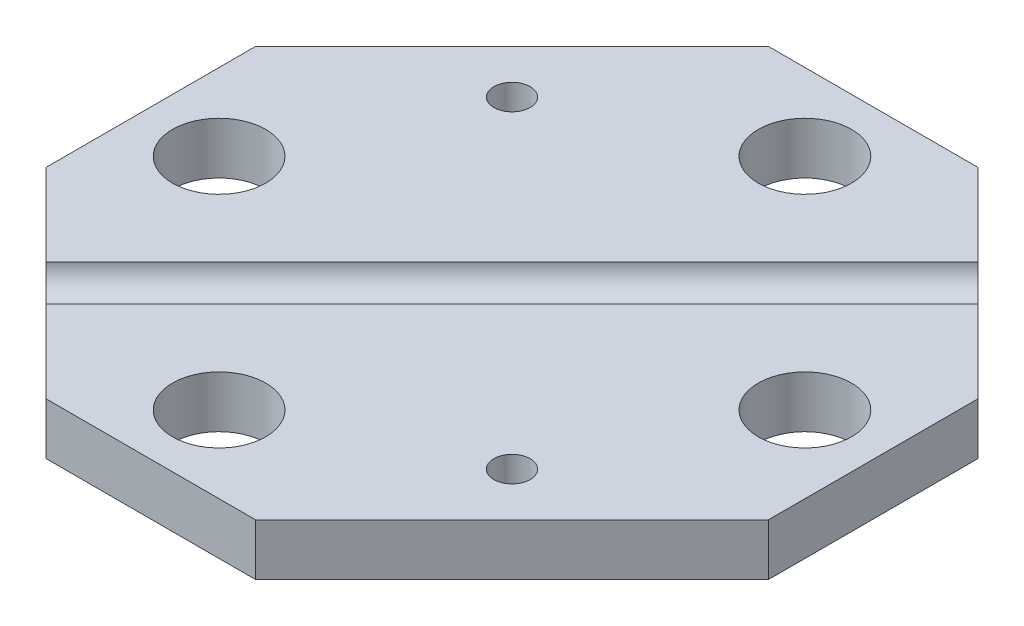
ISO-10303-21;
HEADER;
FILE_DESCRIPTION(('STEP AP214'),'2;1');
FILE_NAME('part.step','',(''),(''),'','','');
FILE_SCHEMA(('AUTOMOTIVE_DESIGN { 1 0 10303 214 1 1 1 1 }'));
ENDSEC;
DATA;
#1=APPLICATION_CONTEXT('core data for automotive mechanical design processes');
#2=APPLICATION_PROTOCOL_DEFINITION('international standard','automotive_design',2000,#1);
#3=PRODUCT_CONTEXT('',#1,'mechanical');
#4=PRODUCT('Part','Part','',(#3));
#5=PRODUCT_RELATED_PRODUCT_CATEGORY('part','',(#4));
#6=PRODUCT_DEFINITION_FORMATION('','',#4);
#7=PRODUCT_DEFINITION_CONTEXT('part definition',#1,'design');
#8=PRODUCT_DEFINITION('design','',#6,#7);
#9=PRODUCT_DEFINITION_SHAPE('','',#8);
#10=(LENGTH_UNIT() NAMED_UNIT(*) SI_UNIT(.MILLI.,.METRE.));
#11=(NAMED_UNIT(*) PLANE_ANGLE_UNIT() SI_UNIT($,.RADIAN.));
#12=(NAMED_UNIT(*) SI_UNIT($,.STERADIAN.) SOLID_ANGLE_UNIT());
#13=UNCERTAINTY_MEASURE_WITH_UNIT(LENGTH_MEASURE(1.E-05),#10,'distance_accuracy_value','');
#14=(GEOMETRIC_REPRESENTATION_CONTEXT(3) GLOBAL_UNCERTAINTY_ASSIGNED_CONTEXT((#13)) GLOBAL_UNIT_ASSIGNED_CONTEXT((#10,
#11,#12)) REPRESENTATION_CONTEXT('',''));
#15=CARTESIAN_POINT('',(0.,0.,0.));
#16=DIRECTION('',(0.,0.,1.));
#17=DIRECTION('',(1.,0.,0.));
#18=AXIS2_PLACEMENT_3D('',#15,#16,#17);
#19=CARTESIAN_POINT('',(0.,5.,0.));
#20=DIRECTION('',(0.,-1.,0.));
#21=DIRECTION('',(0.,0.,-1.));
#22=AXIS2_PLACEMENT_3D('',#19,#20,#21);
#23=PLANE('',#22);
#24=CARTESIAN_POINT('',(-23.6869337565123,5.,-23.6869337565124));
#25=DIRECTION('',(0.,1.,0.));
#26=DIRECTION('',(0.,0.,1.));
#27=AXIS2_PLACEMENT_3D('',#24,#25,#26);
#28=CIRCLE('',#27,1.75000000000001);
#29=CARTESIAN_POINT('',(-23.6869337565123,5.,-21.9369337565123));
#30=VERTEX_POINT('',#29);
#31=EDGE_CURVE('E280',#30,#30,#28,.T.);
#32=ORIENTED_EDGE('',*,*,#31,.F.);
#33=EDGE_LOOP('',(#32));
#34=FACE_BOUND('',#33,.T.);
#35=CARTESIAN_POINT('',(-32.8793219119375,5.,-4.59505066447559));
#36=DIRECTION('',(0.,1.,0.));
#37=DIRECTION('',(0.,0.,1.));
#38=AXIS2_PLACEMENT_3D('',#35,#36,#37);
#39=CIRCLE('',#38,4.5);
#40=CARTESIAN_POINT('',(-32.8793219119375,5.,-0.0950506644755884));
#41=VERTEX_POINT('',#40);
#42=EDGE_CURVE('E259',#41,#41,#39,.T.);
#43=ORIENTED_EDGE('',*,*,#42,.F.);
#44=EDGE_LOOP('',(#43));
#45=FACE_BOUND('',#44,.T.);
#46=CARTESIAN_POINT('',(-4.59505066447554,5.,-32.8793219119374));
#47=DIRECTION('',(0.,1.,0.));
#48=DIRECTION('',(0.,0.,1.));
#49=AXIS2_PLACEMENT_3D('',#46,#47,#48);
#50=CIRCLE('',#49,4.5);
#51=CARTESIAN_POINT('',(-4.59505066447554,5.,-28.3793219119374));
#52=VERTEX_POINT('',#51);
#53=EDGE_CURVE('E251',#52,#52,#50,.T.);
#54=ORIENTED_EDGE('',*,*,#53,.F.);
#55=EDGE_LOOP('',(#54));
#56=FACE_BOUND('',#55,.T.);
#57=DIRECTION('',(0.707106781186547,0.,0.707106781186549));
#58=VECTOR('',#57,1.);
#59=CARTESIAN_POINT('',(-40.3039431143962,5.,4.69479422713291));
#60=LINE('',#59,#58);
#61=CARTESIAN_POINT('',(-40.3039431143962,5.,4.69479422713291));
#62=VERTEX_POINT('',#61);
#63=CARTESIAN_POINT('',(-32.3977201941393,5.,12.6010171473899));
#64=VERTEX_POINT('',#63);
#65=EDGE_CURVE('E111',#62,#64,#60,.T.);
#66=ORIENTED_EDGE('',*,*,#65,.T.);
#67=DIRECTION('',(0.707106781186549,0.,-0.707106781186546));
#68=VECTOR('',#67,1.);
#69=CARTESIAN_POINT('',(-42.0727100673626,5.,22.2760070206132));
#70=LINE('',#69,#68);
#71=CARTESIAN_POINT('',(12.60101714739,5.,-32.3977201941392));
#72=VERTEX_POINT('',#71);
#73=EDGE_CURVE('E135',#64,#72,#70,.T.);
#74=ORIENTED_EDGE('',*,*,#73,.T.);
#75=DIRECTION('',(-0.707106781186546,0.,-0.707106781186549));
#76=VECTOR('',#75,1.);
#77=CARTESIAN_POINT('',(4.69479422713301,5.,-40.3039431143962));
#78=LINE('',#77,#76);
#79=CARTESIAN_POINT('',(4.69479422713301,5.,-40.3039431143962));
#80=VERTEX_POINT('',#79);
#81=EDGE_CURVE('E128',#72,#80,#78,.T.);
#82=ORIENTED_EDGE('',*,*,#81,.T.);
#83=DIRECTION('',(-1.,0.,0.));
#84=VECTOR('',#83,1.);
#85=CARTESIAN_POINT('',(-15.555205772867,5.,-40.3039431143962));
#86=LINE('',#85,#84);
#87=CARTESIAN_POINT('',(-15.555205772867,5.,-40.3039431143962));
#88=VERTEX_POINT('',#87);
#89=EDGE_CURVE('E131',#80,#88,#86,.T.);
#90=ORIENTED_EDGE('',*,*,#89,.T.);
#91=DIRECTION('',(-0.707106781186549,0.,0.707106781186546));
#92=VECTOR('',#91,1.);
#93=CARTESIAN_POINT('',(-40.3039431143962,5.,-15.5552057728671));
#94=LINE('',#93,#92);
#95=CARTESIAN_POINT('',(-40.3039431143962,5.,-15.5552057728671));
#96=VERTEX_POINT('',#95);
#97=EDGE_CURVE('E70',#88,#96,#94,.T.);
#98=ORIENTED_EDGE('',*,*,#97,.T.);
#99=DIRECTION('',(0.,0.,1.));
#100=VECTOR('',#99,1.);
#101=CARTESIAN_POINT('',(-40.3039431143962,5.,-15.5552057728671));
#102=LINE('',#101,#100);
#103=EDGE_CURVE('E187',#96,#62,#102,.T.);
#104=ORIENTED_EDGE('',*,*,#103,.T.);
#105=EDGE_LOOP('',(#66,#74,#82,#90,#98,#104));
#106=FACE_BOUND('',#105,.T.);
#107=ADVANCED_FACE('F45',(#34,#45,#56,#106),#23,.F.);
#108=CARTESIAN_POINT('',(7.42576461569574,5.,7.42576461569574));
#109=DIRECTION('',(0.,1.,0.));
#110=DIRECTION('',(0.,0.,1.));
#111=AXIS2_PLACEMENT_3D('',#108,#109,#110);
#112=CIRCLE('',#111,1.75);
#113=CARTESIAN_POINT('',(7.42576461569574,5.,9.17576461569574));
#114=VERTEX_POINT('',#113);
#115=EDGE_CURVE('E281',#114,#114,#112,.T.);
#116=ORIENTED_EDGE('',*,*,#115,.F.);
#117=EDGE_LOOP('',(#116));
#118=FACE_BOUND('',#117,.T.);
#119=CARTESIAN_POINT('',(24.0427739735796,5.,-20.9559633679495));
#120=VERTEX_POINT('',#119);
#121=CARTESIAN_POINT('',(16.1365510533227,5.,-28.8621862882065));
#122=VERTEX_POINT('',#121);
#123=EDGE_CURVE('E138',#120,#122,#78,.T.);
#124=ORIENTED_EDGE('',*,*,#123,.T.);
#125=DIRECTION('',(0.707106781186549,0.,-0.707106781186546));
#126=VECTOR('',#125,1.);
#127=CARTESIAN_POINT('',(-38.5371761614299,5.,25.8115409265459));
#128=LINE('',#127,#126);
#129=CARTESIAN_POINT('',(-28.8621862882066,5.,16.1365510533226));
#130=VERTEX_POINT('',#129);
#131=EDGE_CURVE('E61',#130,#122,#128,.T.);
#132=ORIENTED_EDGE('',*,*,#131,.F.);
#133=CARTESIAN_POINT('',(-20.9559633679496,5.,24.0427739735796));
#134=VERTEX_POINT('',#133);
#135=EDGE_CURVE('E236',#130,#134,#60,.T.);
#136=ORIENTED_EDGE('',*,*,#135,.T.);
#137=DIRECTION('',(1.,0.,0.));
#138=VECTOR('',#137,1.);
#139=CARTESIAN_POINT('',(-0.705963367949583,5.,24.0427739735796));
#140=LINE('',#139,#138);
#141=CARTESIAN_POINT('',(-0.705963367949583,5.,24.0427739735796));
#142=VERTEX_POINT('',#141);
#143=EDGE_CURVE('E209',#134,#142,#140,.T.);
#144=ORIENTED_EDGE('',*,*,#143,.T.);
#145=DIRECTION('',(0.707106781186549,0.,-0.707106781186546));
#146=VECTOR('',#145,1.);
#147=CARTESIAN_POINT('',(-0.705963367949583,5.,24.0427739735796));
#148=LINE('',#147,#146);
#149=CARTESIAN_POINT('',(24.0427739735796,5.,-0.705963367949539));
#150=VERTEX_POINT('',#149);
#151=EDGE_CURVE('E228',#142,#150,#148,.T.);
#152=ORIENTED_EDGE('',*,*,#151,.T.);
#153=DIRECTION('',(0.,0.,-1.));
#154=VECTOR('',#153,1.);
#155=CARTESIAN_POINT('',(24.0427739735796,5.,-0.705963367949539));
#156=LINE('',#155,#154);
#157=EDGE_CURVE('E139',#150,#120,#156,.T.);
#158=ORIENTED_EDGE('',*,*,#157,.T.);
#159=EDGE_LOOP('',(#124,#132,#136,#144,#152,#158));
#160=FACE_BOUND('',#159,.T.);
#161=CARTESIAN_POINT('',(-11.6661184763411,5.,16.6181527711208));
#162=DIRECTION('',(0.,1.,0.));
#163=DIRECTION('',(0.,0.,1.));
#164=AXIS2_PLACEMENT_3D('',#161,#162,#163);
#165=CIRCLE('',#164,4.5);
#166=CARTESIAN_POINT('',(-11.6661184763411,5.,21.1181527711208));
#167=VERTEX_POINT('',#166);
#168=EDGE_CURVE('E168',#167,#167,#165,.T.);
#169=ORIENTED_EDGE('',*,*,#168,.F.);
#170=EDGE_LOOP('',(#169));
#171=FACE_BOUND('',#170,.T.);
#172=CARTESIAN_POINT('',(16.6181527711209,5.,-11.666118476341));
#173=DIRECTION('',(0.,1.,0.));
#174=DIRECTION('',(0.,0.,1.));
#175=AXIS2_PLACEMENT_3D('',#172,#173,#174);
#176=CIRCLE('',#175,4.5);
#177=CARTESIAN_POINT('',(16.6181527711209,5.,-7.16611847634101));
#178=VERTEX_POINT('',#177);
#179=EDGE_CURVE('E243',#178,#178,#176,.T.);
#180=ORIENTED_EDGE('',*,*,#179,.F.);
#181=EDGE_LOOP('',(#180));
#182=FACE_BOUND('',#181,.T.);
#183=ADVANCED_FACE('F301',(#118,#160,#171,#182),#23,.F.);
#184=CARTESIAN_POINT('',(0.,0.,0.));
#185=DIRECTION('',(0.,-1.,0.));
#186=DIRECTION('',(0.,0.,-1.));
#187=AXIS2_PLACEMENT_3D('',#184,#185,#186);
#188=PLANE('',#187);
#189=CARTESIAN_POINT('',(-23.6869337565123,0.,-23.6869337565124));
#190=DIRECTION('',(0.,-1.,0.));
#191=DIRECTION('',(0.,0.,-1.));
#192=AXIS2_PLACEMENT_3D('',#189,#190,#191);
#193=CIRCLE('',#192,1.75000000000001);
#194=CARTESIAN_POINT('',(-23.6869337565123,0.,-25.4369337565124));
#195=VERTEX_POINT('',#194);
#196=EDGE_CURVE('E289',#195,#195,#193,.F.);
#197=ORIENTED_EDGE('',*,*,#196,.T.);
#198=EDGE_LOOP('',(#197));
#199=FACE_BOUND('',#198,.T.);
#200=CARTESIAN_POINT('',(7.42576461569574,0.,7.42576461569574));
#201=DIRECTION('',(0.,-1.,0.));
#202=DIRECTION('',(0.,0.,-1.));
#203=AXIS2_PLACEMENT_3D('',#200,#201,#202);
#204=CIRCLE('',#203,1.75);
#205=CARTESIAN_POINT('',(7.42576461569574,0.,5.67576461569573));
#206=VERTEX_POINT('',#205);
#207=EDGE_CURVE('E285',#206,#206,#204,.F.);
#208=ORIENTED_EDGE('',*,*,#207,.T.);
#209=EDGE_LOOP('',(#208));
#210=FACE_BOUND('',#209,.T.);
#211=CARTESIAN_POINT('',(-4.59505066447554,0.,-32.8793219119374));
#212=DIRECTION('',(0.,1.,0.));
#213=DIRECTION('',(0.,0.,1.));
#214=AXIS2_PLACEMENT_3D('',#211,#212,#213);
#215=CIRCLE('',#214,4.5);
#216=CARTESIAN_POINT('',(-4.59505066447554,0.,-28.3793219119374));
#217=VERTEX_POINT('',#216);
#218=EDGE_CURVE('E255',#217,#217,#215,.T.);
#219=ORIENTED_EDGE('',*,*,#218,.T.);
#220=EDGE_LOOP('',(#219));
#221=FACE_BOUND('',#220,.T.);
#222=CARTESIAN_POINT('',(-11.6661184763411,0.,16.6181527711208));
#223=DIRECTION('',(0.,1.,0.));
#224=DIRECTION('',(0.,0.,1.));
#225=AXIS2_PLACEMENT_3D('',#222,#223,#224);
#226=CIRCLE('',#225,4.5);
#227=CARTESIAN_POINT('',(-11.6661184763411,0.,21.1181527711208));
#228=VERTEX_POINT('',#227);
#229=EDGE_CURVE('E239',#228,#228,#226,.T.);
#230=ORIENTED_EDGE('',*,*,#229,.T.);
#231=EDGE_LOOP('',(#230));
#232=FACE_BOUND('',#231,.T.);
#233=DIRECTION('',(0.,0.,1.));
#234=VECTOR('',#233,1.);
#235=CARTESIAN_POINT('',(-40.3039431143962,0.,-15.5552057728671));
#236=LINE('',#235,#234);
#237=CARTESIAN_POINT('',(-40.3039431143962,0.,-15.5552057728671));
#238=VERTEX_POINT('',#237);
#239=CARTESIAN_POINT('',(-40.3039431143962,0.,4.69479422713291));
#240=VERTEX_POINT('',#239);
#241=EDGE_CURVE('E163',#238,#240,#236,.T.);
#242=ORIENTED_EDGE('',*,*,#241,.F.);
#243=DIRECTION('',(-0.707106781186549,0.,0.707106781186546));
#244=VECTOR('',#243,1.);
#245=CARTESIAN_POINT('',(-40.3039431143962,0.,-15.5552057728671));
#246=LINE('',#245,#244);
#247=CARTESIAN_POINT('',(-15.555205772867,0.,-40.3039431143962));
#248=VERTEX_POINT('',#247);
#249=EDGE_CURVE('E103',#248,#238,#246,.T.);
#250=ORIENTED_EDGE('',*,*,#249,.F.);
#251=DIRECTION('',(-1.,0.,0.));
#252=VECTOR('',#251,1.);
#253=CARTESIAN_POINT('',(-15.555205772867,0.,-40.3039431143962));
#254=LINE('',#253,#252);
#255=CARTESIAN_POINT('',(4.69479422713301,0.,-40.3039431143962));
#256=VERTEX_POINT('',#255);
#257=EDGE_CURVE('E182',#256,#248,#254,.T.);
#258=ORIENTED_EDGE('',*,*,#257,.F.);
#259=DIRECTION('',(-0.707106781186546,0.,-0.707106781186549));
#260=VECTOR('',#259,1.);
#261=CARTESIAN_POINT('',(4.69479422713301,0.,-40.3039431143962));
#262=LINE('',#261,#260);
#263=CARTESIAN_POINT('',(24.0427739735796,0.,-20.9559633679495));
#264=VERTEX_POINT('',#263);
#265=EDGE_CURVE('E146',#264,#256,#262,.T.);
#266=ORIENTED_EDGE('',*,*,#265,.F.);
#267=DIRECTION('',(0.,0.,-1.));
#268=VECTOR('',#267,1.);
#269=CARTESIAN_POINT('',(24.0427739735796,0.,-0.705963367949539));
#270=LINE('',#269,#268);
#271=CARTESIAN_POINT('',(24.0427739735796,0.,-0.705963367949539));
#272=VERTEX_POINT('',#271);
#273=EDGE_CURVE('E177',#272,#264,#270,.T.);
#274=ORIENTED_EDGE('',*,*,#273,.F.);
#275=DIRECTION('',(0.707106781186549,0.,-0.707106781186546));
#276=VECTOR('',#275,1.);
#277=CARTESIAN_POINT('',(-0.705963367949583,0.,24.0427739735796));
#278=LINE('',#277,#276);
#279=CARTESIAN_POINT('',(-0.705963367949583,0.,24.0427739735796));
#280=VERTEX_POINT('',#279);
#281=EDGE_CURVE('E174',#280,#272,#278,.T.);
#282=ORIENTED_EDGE('',*,*,#281,.F.);
#283=DIRECTION('',(1.,0.,0.));
#284=VECTOR('',#283,1.);
#285=CARTESIAN_POINT('',(-0.705963367949583,0.,24.0427739735796));
#286=LINE('',#285,#284);
#287=CARTESIAN_POINT('',(-20.9559633679496,0.,24.0427739735796));
#288=VERTEX_POINT('',#287);
#289=EDGE_CURVE('E171',#288,#280,#286,.T.);
#290=ORIENTED_EDGE('',*,*,#289,.F.);
#291=DIRECTION('',(0.707106781186547,0.,0.707106781186549));
#292=VECTOR('',#291,1.);
#293=CARTESIAN_POINT('',(-40.3039431143962,0.,4.69479422713291));
#294=LINE('',#293,#292);
#295=EDGE_CURVE('E167',#240,#288,#294,.T.);
#296=ORIENTED_EDGE('',*,*,#295,.F.);
#297=EDGE_LOOP('',(#242,#250,#258,#266,#274,#282,#290,#296));
#298=FACE_BOUND('',#297,.T.);
#299=CARTESIAN_POINT('',(16.6181527711209,0.,-11.666118476341));
#300=DIRECTION('',(0.,1.,0.));
#301=DIRECTION('',(0.,0.,1.));
#302=AXIS2_PLACEMENT_3D('',#299,#300,#301);
#303=CIRCLE('',#302,4.5);
#304=CARTESIAN_POINT('',(16.6181527711209,0.,-7.16611847634101));
#305=VERTEX_POINT('',#304);
#306=EDGE_CURVE('E247',#305,#305,#303,.T.);
#307=ORIENTED_EDGE('',*,*,#306,.T.);
#308=EDGE_LOOP('',(#307));
#309=FACE_BOUND('',#308,.T.);
#310=CARTESIAN_POINT('',(-32.8793219119375,0.,-4.59505066447559));
#311=DIRECTION('',(0.,1.,0.));
#312=DIRECTION('',(0.,0.,1.));
#313=AXIS2_PLACEMENT_3D('',#310,#311,#312);
#314=CIRCLE('',#313,4.5);
#315=CARTESIAN_POINT('',(-32.8793219119375,0.,-0.0950506644755884));
#316=VERTEX_POINT('',#315);
#317=EDGE_CURVE('E263',#316,#316,#314,.T.);
#318=ORIENTED_EDGE('',*,*,#317,.T.);
#319=EDGE_LOOP('',(#318));
#320=FACE_BOUND('',#319,.T.);
#321=ADVANCED_FACE('F214',(#199,#210,#221,#232,#298,#309,#320),#188,.T.);
#322=CARTESIAN_POINT('',(-40.3039431143962,5.,-15.5552057728671));
#323=DIRECTION('',(1.,0.,0.));
#324=DIRECTION('',(0.,0.,-1.));
#325=AXIS2_PLACEMENT_3D('',#322,#323,#324);
#326=PLANE('',#325);
#327=ORIENTED_EDGE('',*,*,#241,.T.);
#328=DIRECTION('',(0.,-1.,0.));
#329=VECTOR('',#328,1.);
#330=CARTESIAN_POINT('',(-40.3039431143962,5.,4.69479422713291));
#331=LINE('',#330,#329);
#332=EDGE_CURVE('E11',#62,#240,#331,.T.);
#333=ORIENTED_EDGE('',*,*,#332,.F.);
#334=ORIENTED_EDGE('',*,*,#103,.F.);
#335=DIRECTION('',(0.,-1.,0.));
#336=VECTOR('',#335,1.);
#337=CARTESIAN_POINT('',(-40.3039431143962,5.,-15.5552057728671));
#338=LINE('',#337,#336);
#339=EDGE_CURVE('E158',#96,#238,#338,.T.);
#340=ORIENTED_EDGE('',*,*,#339,.T.);
#341=EDGE_LOOP('',(#327,#333,#334,#340));
#342=FACE_BOUND('',#341,.T.);
#343=ADVANCED_FACE('F47',(#342),#326,.F.);
#344=CARTESIAN_POINT('',(-40.3039431143962,5.,4.69479422713291));
#345=DIRECTION('',(0.707106781186548,0.,-0.707106781186547));
#346=DIRECTION('',(-0.707106781186547,0.,-0.707106781186548));
#347=AXIS2_PLACEMENT_3D('',#344,#345,#346);
#348=PLANE('',#347);
#349=ORIENTED_EDGE('',*,*,#135,.F.);
#350=CARTESIAN_POINT('',(-30.6299532411729,5.,14.3687841003562));
#351=DIRECTION('',(0.707106781186548,0.,-0.707106781186547));
#352=DIRECTION('',(-0.707106781186547,0.,-0.707106781186548));
#353=AXIS2_PLACEMENT_3D('',#350,#351,#352);
#354=CIRCLE('',#353,2.5);
#355=EDGE_CURVE('E277',#64,#130,#354,.F.);
#356=ORIENTED_EDGE('',*,*,#355,.F.);
#357=ORIENTED_EDGE('',*,*,#65,.F.);
#358=ORIENTED_EDGE('',*,*,#332,.T.);
#359=ORIENTED_EDGE('',*,*,#295,.T.);
#360=DIRECTION('',(0.,-1.,0.));
#361=VECTOR('',#360,1.);
#362=CARTESIAN_POINT('',(-20.9559633679496,5.,24.0427739735796));
#363=LINE('',#362,#361);
#364=EDGE_CURVE('E54',#134,#288,#363,.T.);
#365=ORIENTED_EDGE('',*,*,#364,.F.);
#366=EDGE_LOOP('',(#349,#356,#357,#358,#359,#365));
#367=FACE_BOUND('',#366,.T.);
#368=ADVANCED_FACE('F345',(#367),#348,.F.);
#369=CARTESIAN_POINT('',(-0.705963367949583,5.,24.0427739735796));
#370=DIRECTION('',(0.,0.,-1.));
#371=DIRECTION('',(-1.,0.,0.));
#372=AXIS2_PLACEMENT_3D('',#369,#370,#371);
#373=PLANE('',#372);
#374=ORIENTED_EDGE('',*,*,#289,.T.);
#375=DIRECTION('',(0.,-1.,0.));
#376=VECTOR('',#375,1.);
#377=CARTESIAN_POINT('',(-0.705963367949583,5.,24.0427739735796));
#378=LINE('',#377,#376);
#379=EDGE_CURVE('E198',#142,#280,#378,.T.);
#380=ORIENTED_EDGE('',*,*,#379,.F.);
#381=ORIENTED_EDGE('',*,*,#143,.F.);
#382=ORIENTED_EDGE('',*,*,#364,.T.);
#383=EDGE_LOOP('',(#374,#380,#381,#382));
#384=FACE_BOUND('',#383,.T.);
#385=ADVANCED_FACE('F207',(#384),#373,.F.);
#386=CARTESIAN_POINT('',(-0.705963367949583,5.,24.0427739735796));
#387=DIRECTION('',(-0.707106781186546,0.,-0.707106781186549));
#388=DIRECTION('',(-0.707106781186549,0.,0.707106781186546));
#389=AXIS2_PLACEMENT_3D('',#386,#387,#388);
#390=PLANE('',#389);
#391=ORIENTED_EDGE('',*,*,#281,.T.);
#392=DIRECTION('',(0.,-1.,0.));
#393=VECTOR('',#392,1.);
#394=CARTESIAN_POINT('',(24.0427739735796,5.,-0.705963367949539));
#395=LINE('',#394,#393);
#396=EDGE_CURVE('E194',#150,#272,#395,.T.);
#397=ORIENTED_EDGE('',*,*,#396,.F.);
#398=ORIENTED_EDGE('',*,*,#151,.F.);
#399=ORIENTED_EDGE('',*,*,#379,.T.);
#400=EDGE_LOOP('',(#391,#397,#398,#399));
#401=FACE_BOUND('',#400,.T.);
#402=ADVANCED_FACE('F219',(#401),#390,.F.);
#403=CARTESIAN_POINT('',(24.0427739735796,5.,-0.705963367949539));
#404=DIRECTION('',(-1.,0.,0.));
#405=DIRECTION('',(0.,0.,1.));
#406=AXIS2_PLACEMENT_3D('',#403,#404,#405);
#407=PLANE('',#406);
#408=ORIENTED_EDGE('',*,*,#273,.T.);
#409=DIRECTION('',(0.,-1.,0.));
#410=VECTOR('',#409,1.);
#411=CARTESIAN_POINT('',(24.0427739735796,5.,-20.9559633679495));
#412=LINE('',#411,#410);
#413=EDGE_CURVE('E150',#120,#264,#412,.T.);
#414=ORIENTED_EDGE('',*,*,#413,.F.);
#415=ORIENTED_EDGE('',*,*,#157,.F.);
#416=ORIENTED_EDGE('',*,*,#396,.T.);
#417=EDGE_LOOP('',(#408,#414,#415,#416));
#418=FACE_BOUND('',#417,.T.);
#419=ADVANCED_FACE('F223',(#418),#407,.F.);
#420=CARTESIAN_POINT('',(4.69479422713301,5.,-40.3039431143962));
#421=DIRECTION('',(-0.707106781186549,0.,0.707106781186546));
#422=DIRECTION('',(0.707106781186546,0.,0.707106781186549));
#423=AXIS2_PLACEMENT_3D('',#420,#421,#422);
#424=PLANE('',#423);
#425=ORIENTED_EDGE('',*,*,#81,.F.);
#426=CARTESIAN_POINT('',(14.3687841003563,5.,-30.6299532411729));
#427=DIRECTION('',(0.707106781186549,0.,-0.707106781186546));
#428=DIRECTION('',(-0.707106781186546,0.,-0.707106781186549));
#429=AXIS2_PLACEMENT_3D('',#426,#427,#428);
#430=CIRCLE('',#429,2.5);
#431=EDGE_CURVE('E272',#122,#72,#430,.T.);
#432=ORIENTED_EDGE('',*,*,#431,.F.);
#433=ORIENTED_EDGE('',*,*,#123,.F.);
#434=ORIENTED_EDGE('',*,*,#413,.T.);
#435=ORIENTED_EDGE('',*,*,#265,.T.);
#436=DIRECTION('',(0.,-1.,0.));
#437=VECTOR('',#436,1.);
#438=CARTESIAN_POINT('',(4.69479422713301,5.,-40.3039431143962));
#439=LINE('',#438,#437);
#440=EDGE_CURVE('E142',#80,#256,#439,.T.);
#441=ORIENTED_EDGE('',*,*,#440,.F.);
#442=EDGE_LOOP('',(#425,#432,#433,#434,#435,#441));
#443=FACE_BOUND('',#442,.T.);
#444=ADVANCED_FACE('F143',(#443),#424,.F.);
#445=CARTESIAN_POINT('',(-15.555205772867,5.,-40.3039431143962));
#446=DIRECTION('',(0.,0.,1.));
#447=DIRECTION('',(1.,0.,0.));
#448=AXIS2_PLACEMENT_3D('',#445,#446,#447);
#449=PLANE('',#448);
#450=ORIENTED_EDGE('',*,*,#257,.T.);
#451=DIRECTION('',(0.,-1.,0.));
#452=VECTOR('',#451,1.);
#453=CARTESIAN_POINT('',(-15.555205772867,5.,-40.3039431143962));
#454=LINE('',#453,#452);
#455=EDGE_CURVE('E151',#88,#248,#454,.T.);
#456=ORIENTED_EDGE('',*,*,#455,.F.);
#457=ORIENTED_EDGE('',*,*,#89,.F.);
#458=ORIENTED_EDGE('',*,*,#440,.T.);
#459=EDGE_LOOP('',(#450,#456,#457,#458));
#460=FACE_BOUND('',#459,.T.);
#461=ADVANCED_FACE('F153',(#460),#449,.F.);
#462=CARTESIAN_POINT('',(-40.3039431143962,5.,-15.5552057728671));
#463=DIRECTION('',(0.707106781186546,0.,0.707106781186549));
#464=DIRECTION('',(0.707106781186549,0.,-0.707106781186546));
#465=AXIS2_PLACEMENT_3D('',#462,#463,#464);
#466=PLANE('',#465);
#467=ORIENTED_EDGE('',*,*,#249,.T.);
#468=ORIENTED_EDGE('',*,*,#339,.F.);
#469=ORIENTED_EDGE('',*,*,#97,.F.);
#470=ORIENTED_EDGE('',*,*,#455,.T.);
#471=EDGE_LOOP('',(#467,#468,#469,#470));
#472=FACE_BOUND('',#471,.T.);
#473=ADVANCED_FACE('F323',(#472),#466,.F.);
#474=CARTESIAN_POINT('',(-11.6661184763411,5.,16.6181527711208));
#475=DIRECTION('',(0.,-1.,0.));
#476=DIRECTION('',(0.,0.,-1.));
#477=AXIS2_PLACEMENT_3D('',#474,#475,#476);
#478=CYLINDRICAL_SURFACE('',#477,4.5);
#479=ORIENTED_EDGE('',*,*,#168,.T.);
#480=EDGE_LOOP('',(#479));
#481=FACE_BOUND('',#480,.T.);
#482=ORIENTED_EDGE('',*,*,#229,.F.);
#483=EDGE_LOOP('',(#482));
#484=FACE_BOUND('',#483,.T.);
#485=ADVANCED_FACE('F321',(#481,#484),#478,.F.);
#486=CARTESIAN_POINT('',(16.6181527711209,5.,-11.666118476341));
#487=DIRECTION('',(0.,-1.,0.));
#488=DIRECTION('',(0.,0.,-1.));
#489=AXIS2_PLACEMENT_3D('',#486,#487,#488);
#490=CYLINDRICAL_SURFACE('',#489,4.5);
#491=ORIENTED_EDGE('',*,*,#179,.T.);
#492=EDGE_LOOP('',(#491));
#493=FACE_BOUND('',#492,.T.);
#494=ORIENTED_EDGE('',*,*,#306,.F.);
#495=EDGE_LOOP('',(#494));
#496=FACE_BOUND('',#495,.T.);
#497=ADVANCED_FACE('F311',(#493,#496),#490,.F.);
#498=CARTESIAN_POINT('',(-4.59505066447554,5.,-32.8793219119374));
#499=DIRECTION('',(0.,-1.,0.));
#500=DIRECTION('',(0.,0.,-1.));
#501=AXIS2_PLACEMENT_3D('',#498,#499,#500);
#502=CYLINDRICAL_SURFACE('',#501,4.5);
#503=ORIENTED_EDGE('',*,*,#53,.T.);
#504=EDGE_LOOP('',(#503));
#505=FACE_BOUND('',#504,.T.);
#506=ORIENTED_EDGE('',*,*,#218,.F.);
#507=EDGE_LOOP('',(#506));
#508=FACE_BOUND('',#507,.T.);
#509=ADVANCED_FACE('F307',(#505,#508),#502,.F.);
#510=CARTESIAN_POINT('',(-32.8793219119375,5.,-4.59505066447559));
#511=DIRECTION('',(0.,-1.,0.));
#512=DIRECTION('',(0.,0.,-1.));
#513=AXIS2_PLACEMENT_3D('',#510,#511,#512);
#514=CYLINDRICAL_SURFACE('',#513,4.5);
#515=ORIENTED_EDGE('',*,*,#42,.T.);
#516=EDGE_LOOP('',(#515));
#517=FACE_BOUND('',#516,.T.);
#518=ORIENTED_EDGE('',*,*,#317,.F.);
#519=EDGE_LOOP('',(#518));
#520=FACE_BOUND('',#519,.T.);
#521=ADVANCED_FACE('F310',(#517,#520),#514,.F.);
#522=CARTESIAN_POINT('',(-40.3049431143963,5.,24.0437739735795));
#523=DIRECTION('',(0.707106781186549,0.,-0.707106781186546));
#524=DIRECTION('',(-0.707106781186546,0.,-0.707106781186549));
#525=AXIS2_PLACEMENT_3D('',#522,#523,#524);
#526=CYLINDRICAL_SURFACE('',#525,2.5);
#527=ORIENTED_EDGE('',*,*,#355,.T.);
#528=ORIENTED_EDGE('',*,*,#131,.T.);
#529=ORIENTED_EDGE('',*,*,#431,.T.);
#530=ORIENTED_EDGE('',*,*,#73,.F.);
#531=EDGE_LOOP('',(#527,#528,#529,#530));
#532=FACE_BOUND('',#531,.T.);
#533=ADVANCED_FACE('F355',(#532),#526,.F.);
#534=CARTESIAN_POINT('',(7.42576461569574,-0.00100000000000013,7.42576461569574));
#535=DIRECTION('',(0.,1.,0.));
#536=DIRECTION('',(0.,0.,1.));
#537=AXIS2_PLACEMENT_3D('',#534,#535,#536);
#538=CYLINDRICAL_SURFACE('',#537,1.75);
#539=ORIENTED_EDGE('',*,*,#207,.F.);
#540=EDGE_LOOP('',(#539));
#541=FACE_BOUND('',#540,.T.);
#542=ORIENTED_EDGE('',*,*,#115,.T.);
#543=EDGE_LOOP('',(#542));
#544=FACE_BOUND('',#543,.T.);
#545=ADVANCED_FACE('F358',(#541,#544),#538,.F.);
#546=CARTESIAN_POINT('',(-23.6869337565123,-0.00100000000000013,-23.6869337565124));
#547=DIRECTION('',(0.,1.,0.));
#548=DIRECTION('',(0.,0.,1.));
#549=AXIS2_PLACEMENT_3D('',#546,#547,#548);
#550=CYLINDRICAL_SURFACE('',#549,1.75000000000001);
#551=ORIENTED_EDGE('',*,*,#196,.F.);
#552=EDGE_LOOP('',(#551));
#553=FACE_BOUND('',#552,.T.);
#554=ORIENTED_EDGE('',*,*,#31,.T.);
#555=EDGE_LOOP('',(#554));
#556=FACE_BOUND('',#555,.T.);
#557=ADVANCED_FACE('F297',(#553,#556),#550,.F.);
#558=CLOSED_SHELL('',(#107,#183,#321,#343,#368,#385,#402,#419,#444,#461,#473,#485,#497,#509,
#521,#533,#545,#557));
#559=MANIFOLD_SOLID_BREP('B2',#558);
#560=ADVANCED_BREP_SHAPE_REPRESENTATION('',(#18,#559),#14);
#561=SHAPE_DEFINITION_REPRESENTATION(#9,#560);
ENDSEC;
END-ISO-10303-21;
